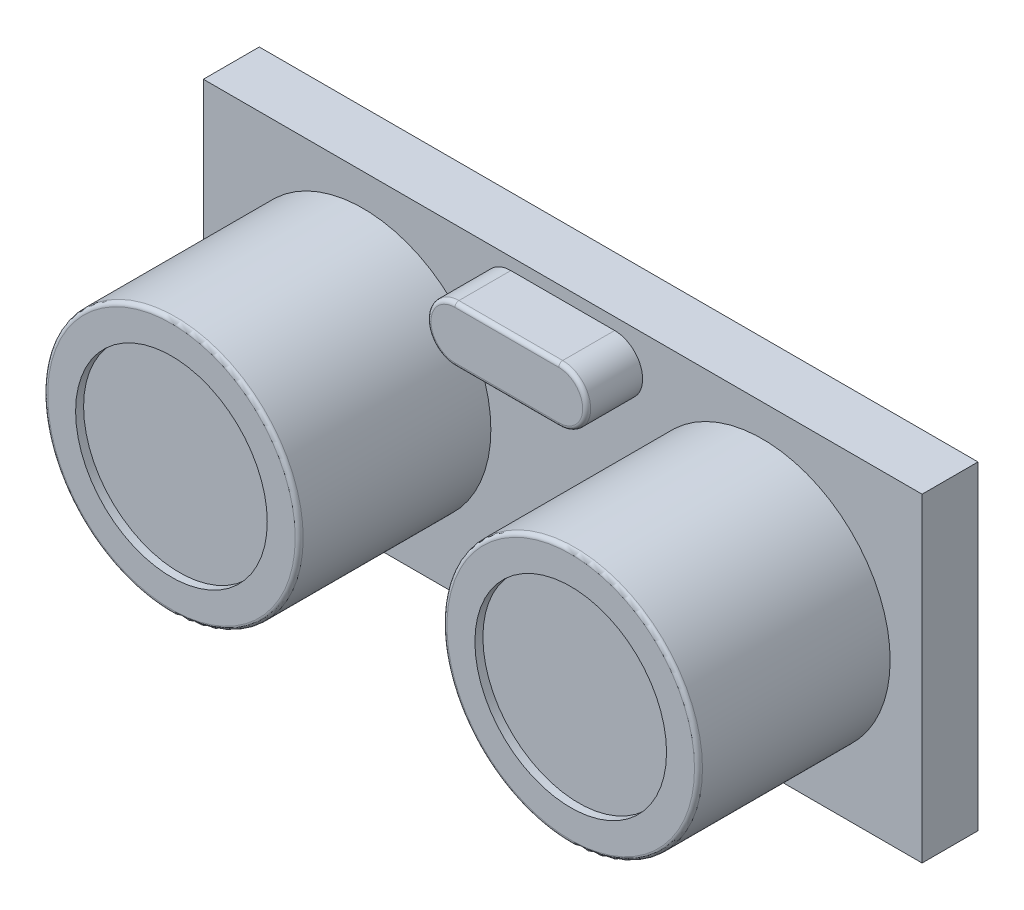
ISO-10303-21;
HEADER;
FILE_DESCRIPTION(('STEP AP214'),'2;1');
FILE_NAME('part.step','',(''),(''),'','','');
FILE_SCHEMA(('AUTOMOTIVE_DESIGN { 1 0 10303 214 1 1 1 1 }'));
ENDSEC;
DATA;
#1=APPLICATION_CONTEXT('core data for automotive mechanical design processes');
#2=APPLICATION_PROTOCOL_DEFINITION('international standard','automotive_design',2000,#1);
#3=PRODUCT_CONTEXT('',#1,'mechanical');
#4=PRODUCT('Part','Part','',(#3));
#5=PRODUCT_RELATED_PRODUCT_CATEGORY('part','',(#4));
#6=PRODUCT_DEFINITION_FORMATION('','',#4);
#7=PRODUCT_DEFINITION_CONTEXT('part definition',#1,'design');
#8=PRODUCT_DEFINITION('design','',#6,#7);
#9=PRODUCT_DEFINITION_SHAPE('','',#8);
#10=(LENGTH_UNIT() NAMED_UNIT(*) SI_UNIT(.MILLI.,.METRE.));
#11=(NAMED_UNIT(*) PLANE_ANGLE_UNIT() SI_UNIT($,.RADIAN.));
#12=(NAMED_UNIT(*) SI_UNIT($,.STERADIAN.) SOLID_ANGLE_UNIT());
#13=UNCERTAINTY_MEASURE_WITH_UNIT(LENGTH_MEASURE(1.E-05),#10,'distance_accuracy_value','');
#14=(GEOMETRIC_REPRESENTATION_CONTEXT(3) GLOBAL_UNCERTAINTY_ASSIGNED_CONTEXT((#13)) GLOBAL_UNIT_ASSIGNED_CONTEXT((#10,
#11,#12)) REPRESENTATION_CONTEXT('',''));
#15=CARTESIAN_POINT('',(0.,0.,0.));
#16=DIRECTION('',(0.,0.,1.));
#17=DIRECTION('',(1.,0.,0.));
#18=AXIS2_PLACEMENT_3D('',#15,#16,#17);
#19=CARTESIAN_POINT('',(0.,0.,3.5));
#20=DIRECTION('',(0.,0.,1.));
#21=DIRECTION('',(1.,0.,0.));
#22=AXIS2_PLACEMENT_3D('',#19,#20,#21);
#23=PLANE('',#22);
#24=CARTESIAN_POINT('',(-12.5,0.,3.5));
#25=DIRECTION('',(0.,0.,1.));
#26=DIRECTION('',(1.,0.,0.));
#27=AXIS2_PLACEMENT_3D('',#24,#25,#26);
#28=CIRCLE('',#27,8.);
#29=CARTESIAN_POINT('',(-4.49999999999999,0.,3.5));
#30=VERTEX_POINT('',#29);
#31=EDGE_CURVE('E149',#30,#30,#28,.T.);
#32=ORIENTED_EDGE('',*,*,#31,.F.);
#33=EDGE_LOOP('',(#32));
#34=FACE_BOUND('',#33,.T.);
#35=CARTESIAN_POINT('',(12.5,0.,3.5));
#36=DIRECTION('',(0.,0.,1.));
#37=DIRECTION('',(1.,0.,0.));
#38=AXIS2_PLACEMENT_3D('',#35,#36,#37);
#39=CIRCLE('',#38,8.00000000000001);
#40=CARTESIAN_POINT('',(20.5,0.,3.5));
#41=VERTEX_POINT('',#40);
#42=EDGE_CURVE('E154',#41,#41,#39,.T.);
#43=ORIENTED_EDGE('',*,*,#42,.F.);
#44=EDGE_LOOP('',(#43));
#45=FACE_BOUND('',#44,.T.);
#46=DIRECTION('',(0.,1.,0.));
#47=VECTOR('',#46,1.);
#48=CARTESIAN_POINT('',(22.5,10.,3.5));
#49=LINE('',#48,#47);
#50=CARTESIAN_POINT('',(22.5,-10.,3.5));
#51=VERTEX_POINT('',#50);
#52=CARTESIAN_POINT('',(22.5,10.,3.5));
#53=VERTEX_POINT('',#52);
#54=EDGE_CURVE('E158',#51,#53,#49,.T.);
#55=ORIENTED_EDGE('',*,*,#54,.T.);
#56=DIRECTION('',(-1.,0.,0.));
#57=VECTOR('',#56,1.);
#58=CARTESIAN_POINT('',(-22.5,10.,3.5));
#59=LINE('',#58,#57);
#60=CARTESIAN_POINT('',(-22.5,10.,3.5));
#61=VERTEX_POINT('',#60);
#62=EDGE_CURVE('E161',#53,#61,#59,.T.);
#63=ORIENTED_EDGE('',*,*,#62,.T.);
#64=DIRECTION('',(0.,-1.,0.));
#65=VECTOR('',#64,1.);
#66=CARTESIAN_POINT('',(-22.5,10.,3.5));
#67=LINE('',#66,#65);
#68=CARTESIAN_POINT('',(-22.5,-10.,3.5));
#69=VERTEX_POINT('',#68);
#70=EDGE_CURVE('E164',#61,#69,#67,.T.);
#71=ORIENTED_EDGE('',*,*,#70,.T.);
#72=DIRECTION('',(1.,0.,0.));
#73=VECTOR('',#72,1.);
#74=CARTESIAN_POINT('',(-22.5,-10.,3.5));
#75=LINE('',#74,#73);
#76=EDGE_CURVE('E166',#69,#51,#75,.T.);
#77=ORIENTED_EDGE('',*,*,#76,.T.);
#78=EDGE_LOOP('',(#55,#63,#71,#77));
#79=FACE_BOUND('',#78,.T.);
#80=DIRECTION('',(1.,0.,0.));
#81=VECTOR('',#80,1.);
#82=CARTESIAN_POINT('',(-3.25,5.75,3.5));
#83=LINE('',#82,#81);
#84=CARTESIAN_POINT('',(-3.25,5.75,3.5));
#85=VERTEX_POINT('',#84);
#86=CARTESIAN_POINT('',(3.25,5.75,3.5));
#87=VERTEX_POINT('',#86);
#88=EDGE_CURVE('E113',#85,#87,#83,.T.);
#89=ORIENTED_EDGE('',*,*,#88,.F.);
#90=CARTESIAN_POINT('',(-3.25,7.5,3.5));
#91=DIRECTION('',(0.,0.,1.));
#92=DIRECTION('',(1.,0.,0.));
#93=AXIS2_PLACEMENT_3D('',#90,#91,#92);
#94=CIRCLE('',#93,1.75);
#95=CARTESIAN_POINT('',(-3.25,9.25,3.5));
#96=VERTEX_POINT('',#95);
#97=EDGE_CURVE('E121',#96,#85,#94,.T.);
#98=ORIENTED_EDGE('',*,*,#97,.F.);
#99=DIRECTION('',(-1.,0.,0.));
#100=VECTOR('',#99,1.);
#101=CARTESIAN_POINT('',(-3.25,9.25,3.5));
#102=LINE('',#101,#100);
#103=CARTESIAN_POINT('',(3.25,9.25,3.5));
#104=VERTEX_POINT('',#103);
#105=EDGE_CURVE('E132',#104,#96,#102,.T.);
#106=ORIENTED_EDGE('',*,*,#105,.F.);
#107=CARTESIAN_POINT('',(3.25,7.5,3.5));
#108=DIRECTION('',(0.,0.,1.));
#109=DIRECTION('',(1.,0.,0.));
#110=AXIS2_PLACEMENT_3D('',#107,#108,#109);
#111=CIRCLE('',#110,1.75);
#112=EDGE_CURVE('E130',#87,#104,#111,.T.);
#113=ORIENTED_EDGE('',*,*,#112,.F.);
#114=EDGE_LOOP('',(#89,#98,#106,#113));
#115=FACE_BOUND('',#114,.T.);
#116=ADVANCED_FACE('F33',(#34,#45,#79,#115),#23,.T.);
#117=CARTESIAN_POINT('',(22.5,10.,3.5));
#118=DIRECTION('',(-1.,0.,0.));
#119=DIRECTION('',(0.,-1.,0.));
#120=AXIS2_PLACEMENT_3D('',#117,#118,#119);
#121=PLANE('',#120);
#122=DIRECTION('',(0.,1.,0.));
#123=VECTOR('',#122,1.);
#124=CARTESIAN_POINT('',(22.5,10.,0.));
#125=LINE('',#124,#123);
#126=CARTESIAN_POINT('',(22.5,-10.,0.));
#127=VERTEX_POINT('',#126);
#128=CARTESIAN_POINT('',(22.5,10.,0.));
#129=VERTEX_POINT('',#128);
#130=EDGE_CURVE('E157',#127,#129,#125,.T.);
#131=ORIENTED_EDGE('',*,*,#130,.T.);
#132=DIRECTION('',(0.,0.,-1.));
#133=VECTOR('',#132,1.);
#134=CARTESIAN_POINT('',(22.5,10.,3.5));
#135=LINE('',#134,#133);
#136=EDGE_CURVE('E184',#53,#129,#135,.T.);
#137=ORIENTED_EDGE('',*,*,#136,.F.);
#138=ORIENTED_EDGE('',*,*,#54,.F.);
#139=DIRECTION('',(0.,0.,-1.));
#140=VECTOR('',#139,1.);
#141=CARTESIAN_POINT('',(22.5,-10.,3.5));
#142=LINE('',#141,#140);
#143=EDGE_CURVE('E168',#51,#127,#142,.T.);
#144=ORIENTED_EDGE('',*,*,#143,.T.);
#145=EDGE_LOOP('',(#131,#137,#138,#144));
#146=FACE_BOUND('',#145,.T.);
#147=ADVANCED_FACE('F248',(#146),#121,.F.);
#148=CARTESIAN_POINT('',(-22.5,10.,3.5));
#149=DIRECTION('',(0.,-1.,0.));
#150=DIRECTION('',(0.,0.,-1.));
#151=AXIS2_PLACEMENT_3D('',#148,#149,#150);
#152=PLANE('',#151);
#153=DIRECTION('',(-1.,0.,0.));
#154=VECTOR('',#153,1.);
#155=CARTESIAN_POINT('',(-22.5,10.,0.));
#156=LINE('',#155,#154);
#157=CARTESIAN_POINT('',(-22.5,10.,0.));
#158=VERTEX_POINT('',#157);
#159=EDGE_CURVE('E171',#129,#158,#156,.T.);
#160=ORIENTED_EDGE('',*,*,#159,.T.);
#161=DIRECTION('',(0.,0.,-1.));
#162=VECTOR('',#161,1.);
#163=CARTESIAN_POINT('',(-22.5,10.,3.5));
#164=LINE('',#163,#162);
#165=EDGE_CURVE('E181',#61,#158,#164,.T.);
#166=ORIENTED_EDGE('',*,*,#165,.F.);
#167=ORIENTED_EDGE('',*,*,#62,.F.);
#168=ORIENTED_EDGE('',*,*,#136,.T.);
#169=EDGE_LOOP('',(#160,#166,#167,#168));
#170=FACE_BOUND('',#169,.T.);
#171=ADVANCED_FACE('F254',(#170),#152,.F.);
#172=CARTESIAN_POINT('',(-22.5,10.,3.5));
#173=DIRECTION('',(1.,0.,0.));
#174=DIRECTION('',(0.,1.,0.));
#175=AXIS2_PLACEMENT_3D('',#172,#173,#174);
#176=PLANE('',#175);
#177=DIRECTION('',(0.,-1.,0.));
#178=VECTOR('',#177,1.);
#179=CARTESIAN_POINT('',(-22.5,10.,0.));
#180=LINE('',#179,#178);
#181=CARTESIAN_POINT('',(-22.5,-10.,0.));
#182=VERTEX_POINT('',#181);
#183=EDGE_CURVE('E173',#158,#182,#180,.T.);
#184=ORIENTED_EDGE('',*,*,#183,.T.);
#185=DIRECTION('',(0.,0.,-1.));
#186=VECTOR('',#185,1.);
#187=CARTESIAN_POINT('',(-22.5,-10.,3.5));
#188=LINE('',#187,#186);
#189=EDGE_CURVE('E178',#69,#182,#188,.T.);
#190=ORIENTED_EDGE('',*,*,#189,.F.);
#191=ORIENTED_EDGE('',*,*,#70,.F.);
#192=ORIENTED_EDGE('',*,*,#165,.T.);
#193=EDGE_LOOP('',(#184,#190,#191,#192));
#194=FACE_BOUND('',#193,.T.);
#195=ADVANCED_FACE('F270',(#194),#176,.F.);
#196=CARTESIAN_POINT('',(-22.5,-10.,3.5));
#197=DIRECTION('',(0.,1.,0.));
#198=DIRECTION('',(0.,0.,1.));
#199=AXIS2_PLACEMENT_3D('',#196,#197,#198);
#200=PLANE('',#199);
#201=DIRECTION('',(1.,0.,0.));
#202=VECTOR('',#201,1.);
#203=CARTESIAN_POINT('',(-22.5,-10.,0.));
#204=LINE('',#203,#202);
#205=EDGE_CURVE('E162',#182,#127,#204,.T.);
#206=ORIENTED_EDGE('',*,*,#205,.T.);
#207=ORIENTED_EDGE('',*,*,#143,.F.);
#208=ORIENTED_EDGE('',*,*,#76,.F.);
#209=ORIENTED_EDGE('',*,*,#189,.T.);
#210=EDGE_LOOP('',(#206,#207,#208,#209));
#211=FACE_BOUND('',#210,.T.);
#212=ADVANCED_FACE('F266',(#211),#200,.F.);
#213=CARTESIAN_POINT('',(0.,0.,0.));
#214=DIRECTION('',(0.,0.,1.));
#215=DIRECTION('',(1.,0.,0.));
#216=AXIS2_PLACEMENT_3D('',#213,#214,#215);
#217=PLANE('',#216);
#218=ORIENTED_EDGE('',*,*,#130,.F.);
#219=ORIENTED_EDGE('',*,*,#205,.F.);
#220=ORIENTED_EDGE('',*,*,#183,.F.);
#221=ORIENTED_EDGE('',*,*,#159,.F.);
#222=EDGE_LOOP('',(#218,#219,#220,#221));
#223=FACE_BOUND('',#222,.T.);
#224=ADVANCED_FACE('F263',(#223),#217,.F.);
#225=CARTESIAN_POINT('',(12.5,0.,15.5));
#226=DIRECTION('',(0.,0.,-1.));
#227=DIRECTION('',(-1.,0.,0.));
#228=AXIS2_PLACEMENT_3D('',#225,#226,#227);
#229=CYLINDRICAL_SURFACE('',#228,8.00000000000001);
#230=CARTESIAN_POINT('',(12.5,0.,15.25));
#231=DIRECTION('',(0.,0.,1.));
#232=DIRECTION('',(1.,0.,0.));
#233=AXIS2_PLACEMENT_3D('',#230,#231,#232);
#234=CIRCLE('',#233,8.00000000000001);
#235=CARTESIAN_POINT('',(20.5,0.,15.25));
#236=VERTEX_POINT('',#235);
#237=EDGE_CURVE('E190',#236,#236,#234,.F.);
#238=ORIENTED_EDGE('',*,*,#237,.T.);
#239=EDGE_LOOP('',(#238));
#240=FACE_BOUND('',#239,.T.);
#241=ORIENTED_EDGE('',*,*,#42,.T.);
#242=EDGE_LOOP('',(#241));
#243=FACE_BOUND('',#242,.T.);
#244=ADVANCED_FACE('F261',(#240,#243),#229,.T.);
#245=CARTESIAN_POINT('',(12.5,0.,15.5));
#246=DIRECTION('',(0.,0.,1.));
#247=DIRECTION('',(1.,0.,0.));
#248=AXIS2_PLACEMENT_3D('',#245,#246,#247);
#249=PLANE('',#248);
#250=CARTESIAN_POINT('',(12.5,0.,15.5));
#251=DIRECTION('',(0.,0.,1.));
#252=DIRECTION('',(1.,0.,0.));
#253=AXIS2_PLACEMENT_3D('',#250,#251,#252);
#254=CIRCLE('',#253,7.75000000000001);
#255=CARTESIAN_POINT('',(20.25,0.,15.5));
#256=VERTEX_POINT('',#255);
#257=EDGE_CURVE('E187',#256,#256,#254,.T.);
#258=ORIENTED_EDGE('',*,*,#257,.T.);
#259=EDGE_LOOP('',(#258));
#260=FACE_BOUND('',#259,.T.);
#261=CARTESIAN_POINT('',(12.5,0.,15.5));
#262=DIRECTION('',(0.,0.,1.));
#263=DIRECTION('',(1.,0.,0.));
#264=AXIS2_PLACEMENT_3D('',#261,#262,#263);
#265=CIRCLE('',#264,6.00000000000001);
#266=CARTESIAN_POINT('',(18.5,0.,15.5));
#267=VERTEX_POINT('',#266);
#268=EDGE_CURVE('E117',#267,#267,#265,.T.);
#269=ORIENTED_EDGE('',*,*,#268,.F.);
#270=EDGE_LOOP('',(#269));
#271=FACE_BOUND('',#270,.T.);
#272=ADVANCED_FACE('F412',(#260,#271),#249,.T.);
#273=CARTESIAN_POINT('',(-12.5,0.,15.5));
#274=DIRECTION('',(0.,0.,-1.));
#275=DIRECTION('',(-1.,0.,0.));
#276=AXIS2_PLACEMENT_3D('',#273,#274,#275);
#277=CYLINDRICAL_SURFACE('',#276,8.);
#278=CARTESIAN_POINT('',(-12.5,0.,15.25));
#279=DIRECTION('',(0.,0.,1.));
#280=DIRECTION('',(1.,0.,0.));
#281=AXIS2_PLACEMENT_3D('',#278,#279,#280);
#282=CIRCLE('',#281,8.);
#283=CARTESIAN_POINT('',(-4.49999999999999,0.,15.25));
#284=VERTEX_POINT('',#283);
#285=EDGE_CURVE('E196',#284,#284,#282,.F.);
#286=ORIENTED_EDGE('',*,*,#285,.T.);
#287=EDGE_LOOP('',(#286));
#288=FACE_BOUND('',#287,.T.);
#289=ORIENTED_EDGE('',*,*,#31,.T.);
#290=EDGE_LOOP('',(#289));
#291=FACE_BOUND('',#290,.T.);
#292=ADVANCED_FACE('F403',(#288,#291),#277,.T.);
#293=CARTESIAN_POINT('',(-12.5,0.,15.5));
#294=DIRECTION('',(0.,0.,1.));
#295=DIRECTION('',(1.,0.,0.));
#296=AXIS2_PLACEMENT_3D('',#293,#294,#295);
#297=PLANE('',#296);
#298=CARTESIAN_POINT('',(-12.5,0.,15.5));
#299=DIRECTION('',(0.,0.,1.));
#300=DIRECTION('',(1.,0.,0.));
#301=AXIS2_PLACEMENT_3D('',#298,#299,#300);
#302=CIRCLE('',#301,7.75);
#303=CARTESIAN_POINT('',(-4.74999999999999,0.,15.5));
#304=VERTEX_POINT('',#303);
#305=EDGE_CURVE('E193',#304,#304,#302,.T.);
#306=ORIENTED_EDGE('',*,*,#305,.T.);
#307=EDGE_LOOP('',(#306));
#308=FACE_BOUND('',#307,.T.);
#309=CARTESIAN_POINT('',(-12.5,0.,15.5));
#310=DIRECTION('',(0.,0.,1.));
#311=DIRECTION('',(1.,0.,0.));
#312=AXIS2_PLACEMENT_3D('',#309,#310,#311);
#313=CIRCLE('',#312,6.00000000000001);
#314=CARTESIAN_POINT('',(-6.49999999999998,0.,15.5));
#315=VERTEX_POINT('',#314);
#316=EDGE_CURVE('E143',#315,#315,#313,.T.);
#317=ORIENTED_EDGE('',*,*,#316,.F.);
#318=EDGE_LOOP('',(#317));
#319=FACE_BOUND('',#318,.T.);
#320=ADVANCED_FACE('F394',(#308,#319),#297,.T.);
#321=CARTESIAN_POINT('',(-12.5,0.,15.));
#322=DIRECTION('',(0.,0.,1.));
#323=DIRECTION('',(1.,0.,0.));
#324=AXIS2_PLACEMENT_3D('',#321,#322,#323);
#325=CYLINDRICAL_SURFACE('',#324,6.00000000000001);
#326=CARTESIAN_POINT('',(-12.5,0.,15.));
#327=DIRECTION('',(0.,0.,1.));
#328=DIRECTION('',(1.,0.,0.));
#329=AXIS2_PLACEMENT_3D('',#326,#327,#328);
#330=CIRCLE('',#329,6.00000000000001);
#331=CARTESIAN_POINT('',(-6.49999999999998,0.,15.));
#332=VERTEX_POINT('',#331);
#333=EDGE_CURVE('E146',#332,#332,#330,.T.);
#334=ORIENTED_EDGE('',*,*,#333,.F.);
#335=EDGE_LOOP('',(#334));
#336=FACE_BOUND('',#335,.T.);
#337=ORIENTED_EDGE('',*,*,#316,.T.);
#338=EDGE_LOOP('',(#337));
#339=FACE_BOUND('',#338,.T.);
#340=ADVANCED_FACE('F385',(#336,#339),#325,.F.);
#341=CARTESIAN_POINT('',(-12.5,0.,15.));
#342=DIRECTION('',(0.,0.,1.));
#343=DIRECTION('',(1.,0.,0.));
#344=AXIS2_PLACEMENT_3D('',#341,#342,#343);
#345=PLANE('',#344);
#346=ORIENTED_EDGE('',*,*,#333,.T.);
#347=EDGE_LOOP('',(#346));
#348=FACE_BOUND('',#347,.T.);
#349=ADVANCED_FACE('F376',(#348),#345,.T.);
#350=CARTESIAN_POINT('',(12.5,0.,15.));
#351=DIRECTION('',(0.,0.,1.));
#352=DIRECTION('',(1.,0.,0.));
#353=AXIS2_PLACEMENT_3D('',#350,#351,#352);
#354=CYLINDRICAL_SURFACE('',#353,6.00000000000001);
#355=CARTESIAN_POINT('',(12.5,0.,15.));
#356=DIRECTION('',(0.,0.,1.));
#357=DIRECTION('',(1.,0.,0.));
#358=AXIS2_PLACEMENT_3D('',#355,#356,#357);
#359=CIRCLE('',#358,6.00000000000001);
#360=CARTESIAN_POINT('',(18.5,0.,15.));
#361=VERTEX_POINT('',#360);
#362=EDGE_CURVE('E140',#361,#361,#359,.T.);
#363=ORIENTED_EDGE('',*,*,#362,.F.);
#364=EDGE_LOOP('',(#363));
#365=FACE_BOUND('',#364,.T.);
#366=ORIENTED_EDGE('',*,*,#268,.T.);
#367=EDGE_LOOP('',(#366));
#368=FACE_BOUND('',#367,.T.);
#369=ADVANCED_FACE('F366',(#365,#368),#354,.F.);
#370=CARTESIAN_POINT('',(12.5,0.,15.));
#371=DIRECTION('',(0.,0.,1.));
#372=DIRECTION('',(1.,0.,0.));
#373=AXIS2_PLACEMENT_3D('',#370,#371,#372);
#374=PLANE('',#373);
#375=ORIENTED_EDGE('',*,*,#362,.T.);
#376=EDGE_LOOP('',(#375));
#377=FACE_BOUND('',#376,.T.);
#378=ADVANCED_FACE('F282',(#377),#374,.T.);
#379=CARTESIAN_POINT('',(12.5,0.,15.25));
#380=DIRECTION('',(0.,0.,1.));
#381=DIRECTION('',(1.,0.,0.));
#382=AXIS2_PLACEMENT_3D('',#379,#380,#381);
#383=TOROIDAL_SURFACE('',#382,7.75000000000001,0.25);
#384=ORIENTED_EDGE('',*,*,#237,.F.);
#385=EDGE_LOOP('',(#384));
#386=FACE_BOUND('',#385,.T.);
#387=ORIENTED_EDGE('',*,*,#257,.F.);
#388=EDGE_LOOP('',(#387));
#389=FACE_BOUND('',#388,.T.);
#390=ADVANCED_FACE('F278',(#386,#389),#383,.T.);
#391=CARTESIAN_POINT('',(-12.5,0.,15.25));
#392=DIRECTION('',(0.,0.,1.));
#393=DIRECTION('',(1.,0.,0.));
#394=AXIS2_PLACEMENT_3D('',#391,#392,#393);
#395=TOROIDAL_SURFACE('',#394,7.75,0.25);
#396=ORIENTED_EDGE('',*,*,#285,.F.);
#397=EDGE_LOOP('',(#396));
#398=FACE_BOUND('',#397,.T.);
#399=ORIENTED_EDGE('',*,*,#305,.F.);
#400=EDGE_LOOP('',(#399));
#401=FACE_BOUND('',#400,.T.);
#402=ADVANCED_FACE('F281',(#398,#401),#395,.T.);
#403=CARTESIAN_POINT('',(-3.25,7.5,7.));
#404=DIRECTION('',(0.,0.,-1.));
#405=DIRECTION('',(-1.,0.,0.));
#406=AXIS2_PLACEMENT_3D('',#403,#404,#405);
#407=CYLINDRICAL_SURFACE('',#406,1.75);
#408=DIRECTION('',(0.,0.,-1.));
#409=VECTOR('',#408,1.);
#410=CARTESIAN_POINT('',(-3.25,5.75,7.));
#411=LINE('',#410,#409);
#412=CARTESIAN_POINT('',(-3.25,5.75,6.75));
#413=VERTEX_POINT('',#412);
#414=EDGE_CURVE('E109',#413,#85,#411,.T.);
#415=ORIENTED_EDGE('',*,*,#414,.F.);
#416=CARTESIAN_POINT('',(-3.25,7.5,6.75));
#417=DIRECTION('',(0.,0.,1.));
#418=DIRECTION('',(1.,0.,0.));
#419=AXIS2_PLACEMENT_3D('',#416,#417,#418);
#420=CIRCLE('',#419,1.75);
#421=CARTESIAN_POINT('',(-3.25,9.25,6.75));
#422=VERTEX_POINT('',#421);
#423=EDGE_CURVE('E11',#413,#422,#420,.F.);
#424=ORIENTED_EDGE('',*,*,#423,.T.);
#425=DIRECTION('',(0.,0.,-1.));
#426=VECTOR('',#425,1.);
#427=CARTESIAN_POINT('',(-3.25,9.25,7.));
#428=LINE('',#427,#426);
#429=EDGE_CURVE('E124',#422,#96,#428,.T.);
#430=ORIENTED_EDGE('',*,*,#429,.T.);
#431=ORIENTED_EDGE('',*,*,#97,.T.);
#432=EDGE_LOOP('',(#415,#424,#430,#431));
#433=FACE_BOUND('',#432,.T.);
#434=ADVANCED_FACE('F122',(#433),#407,.T.);
#435=CARTESIAN_POINT('',(-3.25,5.75,7.));
#436=DIRECTION('',(0.,1.,0.));
#437=DIRECTION('',(0.,0.,1.));
#438=AXIS2_PLACEMENT_3D('',#435,#436,#437);
#439=PLANE('',#438);
#440=DIRECTION('',(0.,0.,-1.));
#441=VECTOR('',#440,1.);
#442=CARTESIAN_POINT('',(3.25,5.75,7.));
#443=LINE('',#442,#441);
#444=CARTESIAN_POINT('',(3.25,5.75,6.75));
#445=VERTEX_POINT('',#444);
#446=EDGE_CURVE('E118',#445,#87,#443,.T.);
#447=ORIENTED_EDGE('',*,*,#446,.F.);
#448=DIRECTION('',(1.,0.,0.));
#449=VECTOR('',#448,1.);
#450=CARTESIAN_POINT('',(-3.25,5.75,6.75));
#451=LINE('',#450,#449);
#452=EDGE_CURVE('E42',#445,#413,#451,.F.);
#453=ORIENTED_EDGE('',*,*,#452,.T.);
#454=ORIENTED_EDGE('',*,*,#414,.T.);
#455=ORIENTED_EDGE('',*,*,#88,.T.);
#456=EDGE_LOOP('',(#447,#453,#454,#455));
#457=FACE_BOUND('',#456,.T.);
#458=ADVANCED_FACE('F111',(#457),#439,.F.);
#459=CARTESIAN_POINT('',(3.25,7.5,7.));
#460=DIRECTION('',(0.,0.,-1.));
#461=DIRECTION('',(-1.,0.,0.));
#462=AXIS2_PLACEMENT_3D('',#459,#460,#461);
#463=CYLINDRICAL_SURFACE('',#462,1.75);
#464=DIRECTION('',(0.,0.,-1.));
#465=VECTOR('',#464,1.);
#466=CARTESIAN_POINT('',(3.25,9.25,7.));
#467=LINE('',#466,#465);
#468=CARTESIAN_POINT('',(3.25,9.25,6.75));
#469=VERTEX_POINT('',#468);
#470=EDGE_CURVE('E137',#469,#104,#467,.T.);
#471=ORIENTED_EDGE('',*,*,#470,.F.);
#472=CARTESIAN_POINT('',(3.25,7.5,6.75));
#473=DIRECTION('',(0.,0.,1.));
#474=DIRECTION('',(1.,0.,0.));
#475=AXIS2_PLACEMENT_3D('',#472,#473,#474);
#476=CIRCLE('',#475,1.75);
#477=EDGE_CURVE('E57',#469,#445,#476,.F.);
#478=ORIENTED_EDGE('',*,*,#477,.T.);
#479=ORIENTED_EDGE('',*,*,#446,.T.);
#480=ORIENTED_EDGE('',*,*,#112,.T.);
#481=EDGE_LOOP('',(#471,#478,#479,#480));
#482=FACE_BOUND('',#481,.T.);
#483=ADVANCED_FACE('F245',(#482),#463,.T.);
#484=CARTESIAN_POINT('',(-3.25,9.25,7.));
#485=DIRECTION('',(0.,-1.,0.));
#486=DIRECTION('',(0.,0.,-1.));
#487=AXIS2_PLACEMENT_3D('',#484,#485,#486);
#488=PLANE('',#487);
#489=ORIENTED_EDGE('',*,*,#429,.F.);
#490=DIRECTION('',(-1.,0.,0.));
#491=VECTOR('',#490,1.);
#492=CARTESIAN_POINT('',(3.25,9.25,6.75));
#493=LINE('',#492,#491);
#494=EDGE_CURVE('E208',#422,#469,#493,.F.);
#495=ORIENTED_EDGE('',*,*,#494,.T.);
#496=ORIENTED_EDGE('',*,*,#470,.T.);
#497=ORIENTED_EDGE('',*,*,#105,.T.);
#498=EDGE_LOOP('',(#489,#495,#496,#497));
#499=FACE_BOUND('',#498,.T.);
#500=ADVANCED_FACE('F233',(#499),#488,.F.);
#501=CARTESIAN_POINT('',(-3.25,7.5,7.));
#502=DIRECTION('',(0.,0.,1.));
#503=DIRECTION('',(1.,0.,0.));
#504=AXIS2_PLACEMENT_3D('',#501,#502,#503);
#505=PLANE('',#504);
#506=CARTESIAN_POINT('',(3.25,7.5,7.));
#507=DIRECTION('',(0.,0.,1.));
#508=DIRECTION('',(1.,0.,0.));
#509=AXIS2_PLACEMENT_3D('',#506,#507,#508);
#510=CIRCLE('',#509,1.5);
#511=CARTESIAN_POINT('',(3.25,6.,7.));
#512=VERTEX_POINT('',#511);
#513=CARTESIAN_POINT('',(3.25,9.,7.));
#514=VERTEX_POINT('',#513);
#515=EDGE_CURVE('E203',#512,#514,#510,.T.);
#516=ORIENTED_EDGE('',*,*,#515,.T.);
#517=DIRECTION('',(-1.,0.,0.));
#518=VECTOR('',#517,1.);
#519=CARTESIAN_POINT('',(-3.25,9.,7.));
#520=LINE('',#519,#518);
#521=CARTESIAN_POINT('',(-3.25,9.,7.));
#522=VERTEX_POINT('',#521);
#523=EDGE_CURVE('E205',#514,#522,#520,.T.);
#524=ORIENTED_EDGE('',*,*,#523,.T.);
#525=CARTESIAN_POINT('',(-3.25,7.5,7.));
#526=DIRECTION('',(0.,0.,1.));
#527=DIRECTION('',(1.,0.,0.));
#528=AXIS2_PLACEMENT_3D('',#525,#526,#527);
#529=CIRCLE('',#528,1.5);
#530=CARTESIAN_POINT('',(-3.25,6.,7.));
#531=VERTEX_POINT('',#530);
#532=EDGE_CURVE('E199',#522,#531,#529,.T.);
#533=ORIENTED_EDGE('',*,*,#532,.T.);
#534=DIRECTION('',(1.,0.,0.));
#535=VECTOR('',#534,1.);
#536=CARTESIAN_POINT('',(3.25,6.,7.));
#537=LINE('',#536,#535);
#538=EDGE_CURVE('E201',#531,#512,#537,.T.);
#539=ORIENTED_EDGE('',*,*,#538,.T.);
#540=EDGE_LOOP('',(#516,#524,#533,#539));
#541=FACE_BOUND('',#540,.T.);
#542=ADVANCED_FACE('F238',(#541),#505,.T.);
#543=CARTESIAN_POINT('',(-3.25,6.,6.75));
#544=DIRECTION('',(-1.,0.,0.));
#545=DIRECTION('',(0.,0.,1.));
#546=AXIS2_PLACEMENT_3D('',#543,#544,#545);
#547=CYLINDRICAL_SURFACE('',#546,0.25);
#548=CARTESIAN_POINT('',(-3.25,6.,6.75));
#549=DIRECTION('',(-1.,0.,0.));
#550=DIRECTION('',(0.,0.,1.));
#551=AXIS2_PLACEMENT_3D('',#548,#549,#550);
#552=CIRCLE('',#551,0.25);
#553=EDGE_CURVE('E216',#413,#531,#552,.T.);
#554=ORIENTED_EDGE('',*,*,#553,.F.);
#555=ORIENTED_EDGE('',*,*,#452,.F.);
#556=CARTESIAN_POINT('',(3.25,6.,6.75));
#557=DIRECTION('',(1.,0.,0.));
#558=DIRECTION('',(0.,0.,-1.));
#559=AXIS2_PLACEMENT_3D('',#556,#557,#558);
#560=CIRCLE('',#559,0.25);
#561=EDGE_CURVE('E37',#512,#445,#560,.T.);
#562=ORIENTED_EDGE('',*,*,#561,.F.);
#563=ORIENTED_EDGE('',*,*,#538,.F.);
#564=EDGE_LOOP('',(#554,#555,#562,#563));
#565=FACE_BOUND('',#564,.T.);
#566=ADVANCED_FACE('F35',(#565),#547,.T.);
#567=CARTESIAN_POINT('',(3.25,7.5,6.75));
#568=DIRECTION('',(0.,0.,1.));
#569=DIRECTION('',(1.,0.,0.));
#570=AXIS2_PLACEMENT_3D('',#567,#568,#569);
#571=TOROIDAL_SURFACE('',#570,1.5,0.25);
#572=ORIENTED_EDGE('',*,*,#561,.T.);
#573=ORIENTED_EDGE('',*,*,#477,.F.);
#574=CARTESIAN_POINT('',(3.25,9.,6.75));
#575=DIRECTION('',(-1.,0.,0.));
#576=DIRECTION('',(0.,0.,1.));
#577=AXIS2_PLACEMENT_3D('',#574,#575,#576);
#578=CIRCLE('',#577,0.25);
#579=EDGE_CURVE('E215',#514,#469,#578,.T.);
#580=ORIENTED_EDGE('',*,*,#579,.F.);
#581=ORIENTED_EDGE('',*,*,#515,.F.);
#582=EDGE_LOOP('',(#572,#573,#580,#581));
#583=FACE_BOUND('',#582,.T.);
#584=ADVANCED_FACE('F225',(#583),#571,.T.);
#585=CARTESIAN_POINT('',(-3.25,7.5,6.75));
#586=DIRECTION('',(0.,0.,1.));
#587=DIRECTION('',(1.,0.,0.));
#588=AXIS2_PLACEMENT_3D('',#585,#586,#587);
#589=TOROIDAL_SURFACE('',#588,1.5,0.25);
#590=ORIENTED_EDGE('',*,*,#553,.T.);
#591=ORIENTED_EDGE('',*,*,#532,.F.);
#592=CARTESIAN_POINT('',(-3.25,9.,6.75));
#593=DIRECTION('',(1.,0.,0.));
#594=DIRECTION('',(0.,0.,-1.));
#595=AXIS2_PLACEMENT_3D('',#592,#593,#594);
#596=CIRCLE('',#595,0.25);
#597=EDGE_CURVE('E213',#422,#522,#596,.T.);
#598=ORIENTED_EDGE('',*,*,#597,.F.);
#599=ORIENTED_EDGE('',*,*,#423,.F.);
#600=EDGE_LOOP('',(#590,#591,#598,#599));
#601=FACE_BOUND('',#600,.T.);
#602=ADVANCED_FACE('F230',(#601),#589,.T.);
#603=CARTESIAN_POINT('',(-3.25,9.,6.75));
#604=DIRECTION('',(1.,0.,0.));
#605=DIRECTION('',(0.,0.,-1.));
#606=AXIS2_PLACEMENT_3D('',#603,#604,#605);
#607=CYLINDRICAL_SURFACE('',#606,0.25);
#608=ORIENTED_EDGE('',*,*,#579,.T.);
#609=ORIENTED_EDGE('',*,*,#494,.F.);
#610=ORIENTED_EDGE('',*,*,#597,.T.);
#611=ORIENTED_EDGE('',*,*,#523,.F.);
#612=EDGE_LOOP('',(#608,#609,#610,#611));
#613=FACE_BOUND('',#612,.T.);
#614=ADVANCED_FACE('F235',(#613),#607,.T.);
#615=CLOSED_SHELL('',(#116,#147,#171,#195,#212,#224,#244,#272,#292,#320,#340,#349,#369,#378,
#390,#402,#434,#458,#483,#500,#542,#566,#584,#602,#614));
#616=MANIFOLD_SOLID_BREP('B2',#615);
#617=ADVANCED_BREP_SHAPE_REPRESENTATION('',(#18,#616),#14);
#618=SHAPE_DEFINITION_REPRESENTATION(#9,#617);
ENDSEC;
END-ISO-10303-21;
